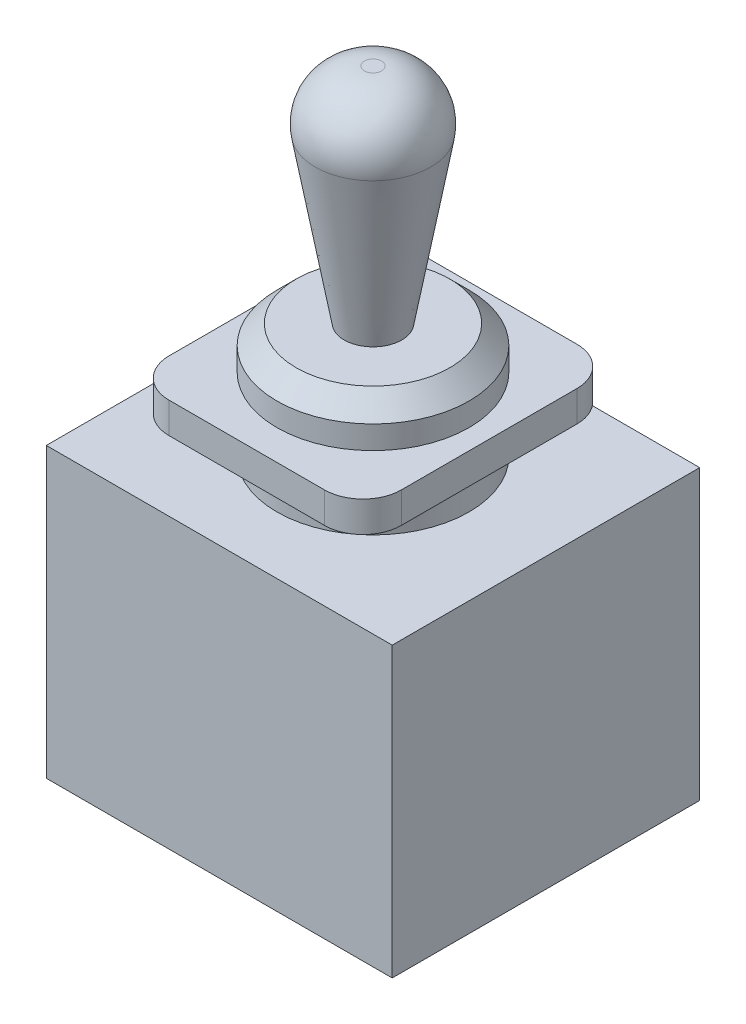
ISO-10303-21;
HEADER;
FILE_DESCRIPTION(('STEP AP214'),'2;1');
FILE_NAME('part.step','',(''),(''),'','','');
FILE_SCHEMA(('AUTOMOTIVE_DESIGN { 1 0 10303 214 1 1 1 1 }'));
ENDSEC;
DATA;
#1=APPLICATION_CONTEXT('core data for automotive mechanical design processes');
#2=APPLICATION_PROTOCOL_DEFINITION('international standard','automotive_design',2000,#1);
#3=PRODUCT_CONTEXT('',#1,'mechanical');
#4=PRODUCT('Part','Part','',(#3));
#5=PRODUCT_RELATED_PRODUCT_CATEGORY('part','',(#4));
#6=PRODUCT_DEFINITION_FORMATION('','',#4);
#7=PRODUCT_DEFINITION_CONTEXT('part definition',#1,'design');
#8=PRODUCT_DEFINITION('design','',#6,#7);
#9=PRODUCT_DEFINITION_SHAPE('','',#8);
#10=(LENGTH_UNIT() NAMED_UNIT(*) SI_UNIT(.MILLI.,.METRE.));
#11=(NAMED_UNIT(*) PLANE_ANGLE_UNIT() SI_UNIT($,.RADIAN.));
#12=(NAMED_UNIT(*) SI_UNIT($,.STERADIAN.) SOLID_ANGLE_UNIT());
#13=UNCERTAINTY_MEASURE_WITH_UNIT(LENGTH_MEASURE(1.E-05),#10,'distance_accuracy_value','');
#14=(GEOMETRIC_REPRESENTATION_CONTEXT(3) GLOBAL_UNCERTAINTY_ASSIGNED_CONTEXT((#13)) GLOBAL_UNIT_ASSIGNED_CONTEXT((#10,
#11,#12)) REPRESENTATION_CONTEXT('',''));
#15=CARTESIAN_POINT('',(0.,0.,0.));
#16=DIRECTION('',(0.,0.,1.));
#17=DIRECTION('',(1.,0.,0.));
#18=AXIS2_PLACEMENT_3D('',#15,#16,#17);
#19=CARTESIAN_POINT('',(4.5,3.75,-4.));
#20=DIRECTION('',(-1.,0.,0.));
#21=DIRECTION('',(0.,0.,1.));
#22=AXIS2_PLACEMENT_3D('',#19,#20,#21);
#23=PLANE('',#22);
#24=DIRECTION('',(0.,0.,-1.));
#25=VECTOR('',#24,1.);
#26=CARTESIAN_POINT('',(4.5,-3.75,-4.));
#27=LINE('',#26,#25);
#28=CARTESIAN_POINT('',(4.5,-3.75,4.));
#29=VERTEX_POINT('',#28);
#30=CARTESIAN_POINT('',(4.5,-3.75,-4.));
#31=VERTEX_POINT('',#30);
#32=EDGE_CURVE('E229',#29,#31,#27,.T.);
#33=ORIENTED_EDGE('',*,*,#32,.T.);
#34=DIRECTION('',(0.,-1.,0.));
#35=VECTOR('',#34,1.);
#36=CARTESIAN_POINT('',(4.5,3.75,-4.));
#37=LINE('',#36,#35);
#38=CARTESIAN_POINT('',(4.5,3.75,-4.));
#39=VERTEX_POINT('',#38);
#40=EDGE_CURVE('E221',#39,#31,#37,.T.);
#41=ORIENTED_EDGE('',*,*,#40,.F.);
#42=DIRECTION('',(0.,0.,-1.));
#43=VECTOR('',#42,1.);
#44=CARTESIAN_POINT('',(4.5,3.75,-4.));
#45=LINE('',#44,#43);
#46=CARTESIAN_POINT('',(4.5,3.75,4.));
#47=VERTEX_POINT('',#46);
#48=EDGE_CURVE('E222',#47,#39,#45,.T.);
#49=ORIENTED_EDGE('',*,*,#48,.F.);
#50=DIRECTION('',(0.,-1.,0.));
#51=VECTOR('',#50,1.);
#52=CARTESIAN_POINT('',(4.5,3.75,4.));
#53=LINE('',#52,#51);
#54=EDGE_CURVE('E228',#47,#29,#53,.T.);
#55=ORIENTED_EDGE('',*,*,#54,.T.);
#56=EDGE_LOOP('',(#33,#41,#49,#55));
#57=FACE_BOUND('',#56,.T.);
#58=ADVANCED_FACE('F39',(#57),#23,.F.);
#59=CARTESIAN_POINT('',(-4.5,3.75,-4.));
#60=DIRECTION('',(0.,0.,1.));
#61=DIRECTION('',(1.,0.,0.));
#62=AXIS2_PLACEMENT_3D('',#59,#60,#61);
#63=PLANE('',#62);
#64=DIRECTION('',(-1.,0.,0.));
#65=VECTOR('',#64,1.);
#66=CARTESIAN_POINT('',(-4.5,-3.75,-4.));
#67=LINE('',#66,#65);
#68=CARTESIAN_POINT('',(-4.5,-3.75,-4.));
#69=VERTEX_POINT('',#68);
#70=EDGE_CURVE('E232',#31,#69,#67,.T.);
#71=ORIENTED_EDGE('',*,*,#70,.T.);
#72=DIRECTION('',(0.,-1.,0.));
#73=VECTOR('',#72,1.);
#74=CARTESIAN_POINT('',(-4.5,3.75,-4.));
#75=LINE('',#74,#73);
#76=CARTESIAN_POINT('',(-4.5,3.75,-4.));
#77=VERTEX_POINT('',#76);
#78=EDGE_CURVE('E239',#77,#69,#75,.T.);
#79=ORIENTED_EDGE('',*,*,#78,.F.);
#80=DIRECTION('',(-1.,0.,0.));
#81=VECTOR('',#80,1.);
#82=CARTESIAN_POINT('',(-4.5,3.75,-4.));
#83=LINE('',#82,#81);
#84=EDGE_CURVE('E88',#39,#77,#83,.T.);
#85=ORIENTED_EDGE('',*,*,#84,.F.);
#86=ORIENTED_EDGE('',*,*,#40,.T.);
#87=EDGE_LOOP('',(#71,#79,#85,#86));
#88=FACE_BOUND('',#87,.T.);
#89=ADVANCED_FACE('F279',(#88),#63,.F.);
#90=CARTESIAN_POINT('',(-4.5,3.75,-4.));
#91=DIRECTION('',(1.,0.,0.));
#92=DIRECTION('',(0.,0.,-1.));
#93=AXIS2_PLACEMENT_3D('',#90,#91,#92);
#94=PLANE('',#93);
#95=DIRECTION('',(0.,0.,1.));
#96=VECTOR('',#95,1.);
#97=CARTESIAN_POINT('',(-4.5,-3.75,-4.));
#98=LINE('',#97,#96);
#99=CARTESIAN_POINT('',(-4.5,-3.75,4.));
#100=VERTEX_POINT('',#99);
#101=EDGE_CURVE('E74',#69,#100,#98,.T.);
#102=ORIENTED_EDGE('',*,*,#101,.T.);
#103=DIRECTION('',(0.,-1.,0.));
#104=VECTOR('',#103,1.);
#105=CARTESIAN_POINT('',(-4.5,3.75,4.));
#106=LINE('',#105,#104);
#107=CARTESIAN_POINT('',(-4.5,3.75,4.));
#108=VERTEX_POINT('',#107);
#109=EDGE_CURVE('E237',#108,#100,#106,.T.);
#110=ORIENTED_EDGE('',*,*,#109,.F.);
#111=DIRECTION('',(0.,0.,1.));
#112=VECTOR('',#111,1.);
#113=CARTESIAN_POINT('',(-4.5,3.75,-4.));
#114=LINE('',#113,#112);
#115=EDGE_CURVE('E225',#77,#108,#114,.T.);
#116=ORIENTED_EDGE('',*,*,#115,.F.);
#117=ORIENTED_EDGE('',*,*,#78,.T.);
#118=EDGE_LOOP('',(#102,#110,#116,#117));
#119=FACE_BOUND('',#118,.T.);
#120=ADVANCED_FACE('F284',(#119),#94,.F.);
#121=CARTESIAN_POINT('',(-4.5,3.75,4.));
#122=DIRECTION('',(0.,0.,-1.));
#123=DIRECTION('',(-1.,0.,0.));
#124=AXIS2_PLACEMENT_3D('',#121,#122,#123);
#125=PLANE('',#124);
#126=DIRECTION('',(1.,0.,0.));
#127=VECTOR('',#126,1.);
#128=CARTESIAN_POINT('',(-4.5,-3.75,4.));
#129=LINE('',#128,#127);
#130=EDGE_CURVE('E80',#100,#29,#129,.T.);
#131=ORIENTED_EDGE('',*,*,#130,.T.);
#132=ORIENTED_EDGE('',*,*,#54,.F.);
#133=DIRECTION('',(1.,0.,0.));
#134=VECTOR('',#133,1.);
#135=CARTESIAN_POINT('',(-4.5,3.75,4.));
#136=LINE('',#135,#134);
#137=EDGE_CURVE('E56',#108,#47,#136,.T.);
#138=ORIENTED_EDGE('',*,*,#137,.F.);
#139=ORIENTED_EDGE('',*,*,#109,.T.);
#140=EDGE_LOOP('',(#131,#132,#138,#139));
#141=FACE_BOUND('',#140,.T.);
#142=ADVANCED_FACE('F289',(#141),#125,.F.);
#143=CARTESIAN_POINT('',(0.,3.75,0.));
#144=DIRECTION('',(0.,1.,0.));
#145=DIRECTION('',(0.,0.,1.));
#146=AXIS2_PLACEMENT_3D('',#143,#144,#145);
#147=PLANE('',#146);
#148=CARTESIAN_POINT('',(0.,3.75,0.));
#149=DIRECTION('',(0.,1.,0.));
#150=DIRECTION('',(0.,0.,1.));
#151=AXIS2_PLACEMENT_3D('',#148,#149,#150);
#152=CIRCLE('',#151,2.5);
#153=CARTESIAN_POINT('',(0.,3.75,2.5));
#154=VERTEX_POINT('',#153);
#155=EDGE_CURVE('E217',#154,#154,#152,.T.);
#156=ORIENTED_EDGE('',*,*,#155,.F.);
#157=EDGE_LOOP('',(#156));
#158=FACE_BOUND('',#157,.T.);
#159=ORIENTED_EDGE('',*,*,#48,.T.);
#160=ORIENTED_EDGE('',*,*,#84,.T.);
#161=ORIENTED_EDGE('',*,*,#115,.T.);
#162=ORIENTED_EDGE('',*,*,#137,.T.);
#163=EDGE_LOOP('',(#159,#160,#161,#162));
#164=FACE_BOUND('',#163,.T.);
#165=ADVANCED_FACE('F292',(#158,#164),#147,.T.);
#166=CARTESIAN_POINT('',(0.,-3.75,0.));
#167=DIRECTION('',(0.,1.,0.));
#168=DIRECTION('',(0.,0.,1.));
#169=AXIS2_PLACEMENT_3D('',#166,#167,#168);
#170=PLANE('',#169);
#171=ORIENTED_EDGE('',*,*,#32,.F.);
#172=ORIENTED_EDGE('',*,*,#130,.F.);
#173=ORIENTED_EDGE('',*,*,#101,.F.);
#174=ORIENTED_EDGE('',*,*,#70,.F.);
#175=EDGE_LOOP('',(#171,#172,#173,#174));
#176=FACE_BOUND('',#175,.T.);
#177=ADVANCED_FACE('F293',(#176),#170,.F.);
#178=CARTESIAN_POINT('',(0.,6.75,0.));
#179=DIRECTION('',(0.,-1.,0.));
#180=DIRECTION('',(0.,0.,-1.));
#181=AXIS2_PLACEMENT_3D('',#178,#179,#180);
#182=CYLINDRICAL_SURFACE('',#181,2.5);
#183=CARTESIAN_POINT('',(0.,4.85,0.));
#184=DIRECTION('',(0.,-1.,0.));
#185=DIRECTION('',(0.,0.,-1.));
#186=AXIS2_PLACEMENT_3D('',#183,#184,#185);
#187=CIRCLE('',#186,2.5);
#188=CARTESIAN_POINT('',(0.,4.85,-2.5));
#189=VERTEX_POINT('',#188);
#190=EDGE_CURVE('E205',#189,#189,#187,.T.);
#191=ORIENTED_EDGE('',*,*,#190,.T.);
#192=EDGE_LOOP('',(#191));
#193=FACE_BOUND('',#192,.T.);
#194=ORIENTED_EDGE('',*,*,#155,.T.);
#195=EDGE_LOOP('',(#194));
#196=FACE_BOUND('',#195,.T.);
#197=ADVANCED_FACE('F275',(#193,#196),#182,.T.);
#198=CARTESIAN_POINT('',(-2.02098771719152,4.85,2.28326018123561));
#199=DIRECTION('',(0.,1.,0.));
#200=DIRECTION('',(0.,0.,1.));
#201=AXIS2_PLACEMENT_3D('',#198,#199,#200);
#202=CYLINDRICAL_SURFACE('',#201,1.);
#203=CARTESIAN_POINT('',(-2.02098771719152,5.65,2.28326018123561));
#204=DIRECTION('',(0.,1.,0.));
#205=DIRECTION('',(0.,0.,-1.));
#206=AXIS2_PLACEMENT_3D('',#203,#204,#205);
#207=CIRCLE('',#206,1.);
#208=CARTESIAN_POINT('',(-3.02098771719152,5.65,2.28326018123561));
#209=VERTEX_POINT('',#208);
#210=CARTESIAN_POINT('',(-2.02098771719152,5.65,3.28326018123561));
#211=VERTEX_POINT('',#210);
#212=EDGE_CURVE('E187',#209,#211,#207,.T.);
#213=ORIENTED_EDGE('',*,*,#212,.F.);
#214=DIRECTION('',(0.,1.,0.));
#215=VECTOR('',#214,1.);
#216=CARTESIAN_POINT('',(-3.02098771719152,4.85,2.28326018123561));
#217=LINE('',#216,#215);
#218=CARTESIAN_POINT('',(-3.02098771719152,4.85,2.28326018123561));
#219=VERTEX_POINT('',#218);
#220=EDGE_CURVE('E164',#219,#209,#217,.T.);
#221=ORIENTED_EDGE('',*,*,#220,.F.);
#222=CARTESIAN_POINT('',(-2.02098771719152,4.85,2.28326018123561));
#223=DIRECTION('',(0.,1.,0.));
#224=DIRECTION('',(0.,0.,-1.));
#225=AXIS2_PLACEMENT_3D('',#222,#223,#224);
#226=CIRCLE('',#225,1.);
#227=CARTESIAN_POINT('',(-2.02098771719152,4.85,3.28326018123561));
#228=VERTEX_POINT('',#227);
#229=EDGE_CURVE('E157',#219,#228,#226,.T.);
#230=ORIENTED_EDGE('',*,*,#229,.T.);
#231=DIRECTION('',(0.,1.,0.));
#232=VECTOR('',#231,1.);
#233=CARTESIAN_POINT('',(-2.02098771719152,4.85,3.28326018123561));
#234=LINE('',#233,#232);
#235=EDGE_CURVE('E139',#228,#211,#234,.T.);
#236=ORIENTED_EDGE('',*,*,#235,.T.);
#237=EDGE_LOOP('',(#213,#221,#230,#236));
#238=FACE_BOUND('',#237,.T.);
#239=ADVANCED_FACE('F163',(#238),#202,.T.);
#240=CARTESIAN_POINT('',(-3.02098771719152,4.85,2.28326018123561));
#241=DIRECTION('',(-1.,0.,0.));
#242=DIRECTION('',(0.,0.,1.));
#243=AXIS2_PLACEMENT_3D('',#240,#241,#242);
#244=PLANE('',#243);
#245=DIRECTION('',(0.,0.,1.));
#246=VECTOR('',#245,1.);
#247=CARTESIAN_POINT('',(-3.02098771719152,5.65,2.28326018123561));
#248=LINE('',#247,#246);
#249=CARTESIAN_POINT('',(-3.02098771719152,5.65,-2.28326018123561));
#250=VERTEX_POINT('',#249);
#251=EDGE_CURVE('E165',#250,#209,#248,.T.);
#252=ORIENTED_EDGE('',*,*,#251,.F.);
#253=DIRECTION('',(0.,1.,0.));
#254=VECTOR('',#253,1.);
#255=CARTESIAN_POINT('',(-3.02098771719152,4.85,-2.28326018123561));
#256=LINE('',#255,#254);
#257=CARTESIAN_POINT('',(-3.02098771719152,4.85,-2.28326018123561));
#258=VERTEX_POINT('',#257);
#259=EDGE_CURVE('E206',#258,#250,#256,.T.);
#260=ORIENTED_EDGE('',*,*,#259,.F.);
#261=DIRECTION('',(0.,0.,1.));
#262=VECTOR('',#261,1.);
#263=CARTESIAN_POINT('',(-3.02098771719152,4.85,2.28326018123561));
#264=LINE('',#263,#262);
#265=EDGE_CURVE('E150',#258,#219,#264,.T.);
#266=ORIENTED_EDGE('',*,*,#265,.T.);
#267=ORIENTED_EDGE('',*,*,#220,.T.);
#268=EDGE_LOOP('',(#252,#260,#266,#267));
#269=FACE_BOUND('',#268,.T.);
#270=ADVANCED_FACE('F304',(#269),#244,.T.);
#271=CARTESIAN_POINT('',(-2.02098771719152,4.85,-2.28326018123561));
#272=DIRECTION('',(0.,1.,0.));
#273=DIRECTION('',(0.,0.,1.));
#274=AXIS2_PLACEMENT_3D('',#271,#272,#273);
#275=CYLINDRICAL_SURFACE('',#274,1.);
#276=CARTESIAN_POINT('',(-2.02098771719152,5.65,-2.28326018123561));
#277=DIRECTION('',(0.,1.,0.));
#278=DIRECTION('',(0.,0.,-1.));
#279=AXIS2_PLACEMENT_3D('',#276,#277,#278);
#280=CIRCLE('',#279,1.);
#281=CARTESIAN_POINT('',(-2.02098771719152,5.65,-3.28326018123561));
#282=VERTEX_POINT('',#281);
#283=EDGE_CURVE('E168',#282,#250,#280,.T.);
#284=ORIENTED_EDGE('',*,*,#283,.F.);
#285=DIRECTION('',(0.,1.,0.));
#286=VECTOR('',#285,1.);
#287=CARTESIAN_POINT('',(-2.02098771719152,4.85,-3.28326018123561));
#288=LINE('',#287,#286);
#289=CARTESIAN_POINT('',(-2.02098771719152,4.85,-3.28326018123561));
#290=VERTEX_POINT('',#289);
#291=EDGE_CURVE('E208',#290,#282,#288,.T.);
#292=ORIENTED_EDGE('',*,*,#291,.F.);
#293=CARTESIAN_POINT('',(-2.02098771719152,4.85,-2.28326018123561));
#294=DIRECTION('',(0.,1.,0.));
#295=DIRECTION('',(0.,0.,-1.));
#296=AXIS2_PLACEMENT_3D('',#293,#294,#295);
#297=CIRCLE('',#296,1.);
#298=EDGE_CURVE('E183',#290,#258,#297,.T.);
#299=ORIENTED_EDGE('',*,*,#298,.T.);
#300=ORIENTED_EDGE('',*,*,#259,.T.);
#301=EDGE_LOOP('',(#284,#292,#299,#300));
#302=FACE_BOUND('',#301,.T.);
#303=ADVANCED_FACE('F322',(#302),#275,.T.);
#304=CARTESIAN_POINT('',(-2.02098771719152,4.85,-3.28326018123561));
#305=DIRECTION('',(0.,0.,-1.));
#306=DIRECTION('',(-1.,0.,0.));
#307=AXIS2_PLACEMENT_3D('',#304,#305,#306);
#308=PLANE('',#307);
#309=DIRECTION('',(-1.,0.,0.));
#310=VECTOR('',#309,1.);
#311=CARTESIAN_POINT('',(-2.02098771719152,5.65,-3.28326018123561));
#312=LINE('',#311,#310);
#313=CARTESIAN_POINT('',(2.02098771719152,5.65,-3.28326018123561));
#314=VERTEX_POINT('',#313);
#315=EDGE_CURVE('E199',#314,#282,#312,.T.);
#316=ORIENTED_EDGE('',*,*,#315,.F.);
#317=DIRECTION('',(0.,1.,0.));
#318=VECTOR('',#317,1.);
#319=CARTESIAN_POINT('',(2.02098771719152,4.85,-3.28326018123561));
#320=LINE('',#319,#318);
#321=CARTESIAN_POINT('',(2.02098771719152,4.85,-3.28326018123561));
#322=VERTEX_POINT('',#321);
#323=EDGE_CURVE('E210',#322,#314,#320,.T.);
#324=ORIENTED_EDGE('',*,*,#323,.F.);
#325=DIRECTION('',(-1.,0.,0.));
#326=VECTOR('',#325,1.);
#327=CARTESIAN_POINT('',(-2.02098771719152,4.85,-3.28326018123561));
#328=LINE('',#327,#326);
#329=EDGE_CURVE('E180',#322,#290,#328,.T.);
#330=ORIENTED_EDGE('',*,*,#329,.T.);
#331=ORIENTED_EDGE('',*,*,#291,.T.);
#332=EDGE_LOOP('',(#316,#324,#330,#331));
#333=FACE_BOUND('',#332,.T.);
#334=ADVANCED_FACE('F318',(#333),#308,.T.);
#335=CARTESIAN_POINT('',(2.02098771719152,4.85,-2.28326018123561));
#336=DIRECTION('',(0.,1.,0.));
#337=DIRECTION('',(0.,0.,1.));
#338=AXIS2_PLACEMENT_3D('',#335,#336,#337);
#339=CYLINDRICAL_SURFACE('',#338,1.);
#340=CARTESIAN_POINT('',(2.02098771719152,5.65,-2.28326018123561));
#341=DIRECTION('',(0.,1.,0.));
#342=DIRECTION('',(0.,0.,1.));
#343=AXIS2_PLACEMENT_3D('',#340,#341,#342);
#344=CIRCLE('',#343,1.);
#345=CARTESIAN_POINT('',(3.02098771719152,5.65,-2.28326018123561));
#346=VERTEX_POINT('',#345);
#347=EDGE_CURVE('E196',#346,#314,#344,.T.);
#348=ORIENTED_EDGE('',*,*,#347,.F.);
#349=DIRECTION('',(0.,1.,0.));
#350=VECTOR('',#349,1.);
#351=CARTESIAN_POINT('',(3.02098771719152,4.85,-2.28326018123561));
#352=LINE('',#351,#350);
#353=CARTESIAN_POINT('',(3.02098771719152,4.85,-2.28326018123561));
#354=VERTEX_POINT('',#353);
#355=EDGE_CURVE('E212',#354,#346,#352,.T.);
#356=ORIENTED_EDGE('',*,*,#355,.F.);
#357=CARTESIAN_POINT('',(2.02098771719152,4.85,-2.28326018123561));
#358=DIRECTION('',(0.,1.,0.));
#359=DIRECTION('',(0.,0.,1.));
#360=AXIS2_PLACEMENT_3D('',#357,#358,#359);
#361=CIRCLE('',#360,1.);
#362=EDGE_CURVE('E177',#354,#322,#361,.T.);
#363=ORIENTED_EDGE('',*,*,#362,.T.);
#364=ORIENTED_EDGE('',*,*,#323,.T.);
#365=EDGE_LOOP('',(#348,#356,#363,#364));
#366=FACE_BOUND('',#365,.T.);
#367=ADVANCED_FACE('F314',(#366),#339,.T.);
#368=CARTESIAN_POINT('',(3.02098771719152,4.85,2.28326018123561));
#369=DIRECTION('',(1.,0.,0.));
#370=DIRECTION('',(0.,0.,-1.));
#371=AXIS2_PLACEMENT_3D('',#368,#369,#370);
#372=PLANE('',#371);
#373=DIRECTION('',(0.,0.,-1.));
#374=VECTOR('',#373,1.);
#375=CARTESIAN_POINT('',(3.02098771719152,5.65,2.28326018123561));
#376=LINE('',#375,#374);
#377=CARTESIAN_POINT('',(3.02098771719152,5.65,2.28326018123561));
#378=VERTEX_POINT('',#377);
#379=EDGE_CURVE('E193',#378,#346,#376,.T.);
#380=ORIENTED_EDGE('',*,*,#379,.F.);
#381=DIRECTION('',(0.,1.,0.));
#382=VECTOR('',#381,1.);
#383=CARTESIAN_POINT('',(3.02098771719152,4.85,2.28326018123561));
#384=LINE('',#383,#382);
#385=CARTESIAN_POINT('',(3.02098771719152,4.85,2.28326018123561));
#386=VERTEX_POINT('',#385);
#387=EDGE_CURVE('E214',#386,#378,#384,.T.);
#388=ORIENTED_EDGE('',*,*,#387,.F.);
#389=DIRECTION('',(0.,0.,-1.));
#390=VECTOR('',#389,1.);
#391=CARTESIAN_POINT('',(3.02098771719152,4.85,2.28326018123561));
#392=LINE('',#391,#390);
#393=EDGE_CURVE('E174',#386,#354,#392,.T.);
#394=ORIENTED_EDGE('',*,*,#393,.T.);
#395=ORIENTED_EDGE('',*,*,#355,.T.);
#396=EDGE_LOOP('',(#380,#388,#394,#395));
#397=FACE_BOUND('',#396,.T.);
#398=ADVANCED_FACE('F310',(#397),#372,.T.);
#399=CARTESIAN_POINT('',(2.02098771719152,4.85,2.28326018123561));
#400=DIRECTION('',(0.,1.,0.));
#401=DIRECTION('',(0.,0.,1.));
#402=AXIS2_PLACEMENT_3D('',#399,#400,#401);
#403=CYLINDRICAL_SURFACE('',#402,1.);
#404=CARTESIAN_POINT('',(2.02098771719152,5.65,2.28326018123561));
#405=DIRECTION('',(0.,1.,0.));
#406=DIRECTION('',(0.,0.,-1.));
#407=AXIS2_PLACEMENT_3D('',#404,#405,#406);
#408=CIRCLE('',#407,1.);
#409=CARTESIAN_POINT('',(2.02098771719152,5.65,3.28326018123561));
#410=VERTEX_POINT('',#409);
#411=EDGE_CURVE('E190',#410,#378,#408,.T.);
#412=ORIENTED_EDGE('',*,*,#411,.F.);
#413=DIRECTION('',(0.,1.,0.));
#414=VECTOR('',#413,1.);
#415=CARTESIAN_POINT('',(2.02098771719152,4.85,3.28326018123561));
#416=LINE('',#415,#414);
#417=CARTESIAN_POINT('',(2.02098771719152,4.85,3.28326018123561));
#418=VERTEX_POINT('',#417);
#419=EDGE_CURVE('E149',#418,#410,#416,.T.);
#420=ORIENTED_EDGE('',*,*,#419,.F.);
#421=CARTESIAN_POINT('',(2.02098771719152,4.85,2.28326018123561));
#422=DIRECTION('',(0.,1.,0.));
#423=DIRECTION('',(0.,0.,-1.));
#424=AXIS2_PLACEMENT_3D('',#421,#422,#423);
#425=CIRCLE('',#424,1.);
#426=EDGE_CURVE('E161',#418,#386,#425,.T.);
#427=ORIENTED_EDGE('',*,*,#426,.T.);
#428=ORIENTED_EDGE('',*,*,#387,.T.);
#429=EDGE_LOOP('',(#412,#420,#427,#428));
#430=FACE_BOUND('',#429,.T.);
#431=ADVANCED_FACE('F307',(#430),#403,.T.);
#432=CARTESIAN_POINT('',(-2.02098771719152,4.85,3.28326018123561));
#433=DIRECTION('',(0.,0.,1.));
#434=DIRECTION('',(1.,0.,0.));
#435=AXIS2_PLACEMENT_3D('',#432,#433,#434);
#436=PLANE('',#435);
#437=DIRECTION('',(1.,0.,0.));
#438=VECTOR('',#437,1.);
#439=CARTESIAN_POINT('',(-2.02098771719152,5.65,3.28326018123561));
#440=LINE('',#439,#438);
#441=EDGE_CURVE('E144',#211,#410,#440,.T.);
#442=ORIENTED_EDGE('',*,*,#441,.F.);
#443=ORIENTED_EDGE('',*,*,#235,.F.);
#444=DIRECTION('',(1.,0.,0.));
#445=VECTOR('',#444,1.);
#446=CARTESIAN_POINT('',(-2.02098771719152,4.85,3.28326018123561));
#447=LINE('',#446,#445);
#448=EDGE_CURVE('E142',#228,#418,#447,.T.);
#449=ORIENTED_EDGE('',*,*,#448,.T.);
#450=ORIENTED_EDGE('',*,*,#419,.T.);
#451=EDGE_LOOP('',(#442,#443,#449,#450));
#452=FACE_BOUND('',#451,.T.);
#453=ADVANCED_FACE('F141',(#452),#436,.T.);
#454=CARTESIAN_POINT('',(-2.02098771719152,4.85,2.28326018123561));
#455=DIRECTION('',(0.,-1.,0.));
#456=DIRECTION('',(0.,0.,-1.));
#457=AXIS2_PLACEMENT_3D('',#454,#455,#456);
#458=PLANE('',#457);
#459=ORIENTED_EDGE('',*,*,#190,.F.);
#460=EDGE_LOOP('',(#459));
#461=FACE_BOUND('',#460,.T.);
#462=ORIENTED_EDGE('',*,*,#229,.F.);
#463=ORIENTED_EDGE('',*,*,#265,.F.);
#464=ORIENTED_EDGE('',*,*,#298,.F.);
#465=ORIENTED_EDGE('',*,*,#329,.F.);
#466=ORIENTED_EDGE('',*,*,#362,.F.);
#467=ORIENTED_EDGE('',*,*,#393,.F.);
#468=ORIENTED_EDGE('',*,*,#426,.F.);
#469=ORIENTED_EDGE('',*,*,#448,.F.);
#470=EDGE_LOOP('',(#462,#463,#464,#465,#466,#467,#468,#469));
#471=FACE_BOUND('',#470,.T.);
#472=ADVANCED_FACE('F155',(#461,#471),#458,.T.);
#473=CARTESIAN_POINT('',(-2.02098771719152,5.65,2.28326018123561));
#474=DIRECTION('',(0.,-1.,0.));
#475=DIRECTION('',(0.,0.,-1.));
#476=AXIS2_PLACEMENT_3D('',#473,#474,#475);
#477=PLANE('',#476);
#478=CARTESIAN_POINT('',(0.,5.65,0.));
#479=DIRECTION('',(0.,-1.,0.));
#480=DIRECTION('',(0.,0.,-1.));
#481=AXIS2_PLACEMENT_3D('',#478,#479,#480);
#482=CIRCLE('',#481,2.5);
#483=CARTESIAN_POINT('',(0.,5.65,-2.5));
#484=VERTEX_POINT('',#483);
#485=EDGE_CURVE('E247',#484,#484,#482,.T.);
#486=ORIENTED_EDGE('',*,*,#485,.T.);
#487=EDGE_LOOP('',(#486));
#488=FACE_BOUND('',#487,.T.);
#489=ORIENTED_EDGE('',*,*,#212,.T.);
#490=ORIENTED_EDGE('',*,*,#441,.T.);
#491=ORIENTED_EDGE('',*,*,#411,.T.);
#492=ORIENTED_EDGE('',*,*,#379,.T.);
#493=ORIENTED_EDGE('',*,*,#347,.T.);
#494=ORIENTED_EDGE('',*,*,#315,.T.);
#495=ORIENTED_EDGE('',*,*,#283,.T.);
#496=ORIENTED_EDGE('',*,*,#251,.T.);
#497=EDGE_LOOP('',(#489,#490,#491,#492,#493,#494,#495,#496));
#498=FACE_BOUND('',#497,.T.);
#499=ADVANCED_FACE('F263',(#488,#498),#477,.F.);
#500=CARTESIAN_POINT('',(0.,6.75,0.));
#501=DIRECTION('',(0.,1.,0.));
#502=DIRECTION('',(0.,0.,1.));
#503=AXIS2_PLACEMENT_3D('',#500,#501,#502);
#504=PLANE('',#503);
#505=CARTESIAN_POINT('',(0.,6.75,0.));
#506=DIRECTION('',(0.,1.,0.));
#507=DIRECTION('',(0.,0.,1.));
#508=AXIS2_PLACEMENT_3D('',#505,#506,#507);
#509=CIRCLE('',#508,0.75);
#510=CARTESIAN_POINT('',(0.,6.75,0.75));
#511=VERTEX_POINT('',#510);
#512=EDGE_CURVE('E171',#511,#511,#509,.T.);
#513=ORIENTED_EDGE('',*,*,#512,.F.);
#514=EDGE_LOOP('',(#513));
#515=FACE_BOUND('',#514,.T.);
#516=CARTESIAN_POINT('',(0.,6.75,0.));
#517=DIRECTION('',(0.,1.,0.));
#518=DIRECTION('',(0.,0.,1.));
#519=AXIS2_PLACEMENT_3D('',#516,#517,#518);
#520=CIRCLE('',#519,2.);
#521=CARTESIAN_POINT('',(0.,6.75,2.));
#522=VERTEX_POINT('',#521);
#523=EDGE_CURVE('E220',#522,#522,#520,.T.);
#524=ORIENTED_EDGE('',*,*,#523,.T.);
#525=EDGE_LOOP('',(#524));
#526=FACE_BOUND('',#525,.T.);
#527=ADVANCED_FACE('F259',(#515,#526),#504,.T.);
#528=CARTESIAN_POINT('',(0.,6.75,0.));
#529=DIRECTION('',(0.,-1.,0.));
#530=DIRECTION('',(0.,0.,-1.));
#531=AXIS2_PLACEMENT_3D('',#528,#529,#530);
#532=CONICAL_SURFACE('',#531,2.,0.785398163397446);
#533=CARTESIAN_POINT('',(0.,6.25,0.));
#534=DIRECTION('',(0.,1.,0.));
#535=DIRECTION('',(0.,0.,1.));
#536=AXIS2_PLACEMENT_3D('',#533,#534,#535);
#537=CIRCLE('',#536,2.5);
#538=CARTESIAN_POINT('',(0.,6.25,2.5));
#539=VERTEX_POINT('',#538);
#540=EDGE_CURVE('E244',#539,#539,#537,.F.);
#541=ORIENTED_EDGE('',*,*,#540,.F.);
#542=EDGE_LOOP('',(#541));
#543=FACE_BOUND('',#542,.T.);
#544=ORIENTED_EDGE('',*,*,#523,.F.);
#545=EDGE_LOOP('',(#544));
#546=FACE_BOUND('',#545,.T.);
#547=ADVANCED_FACE('F262',(#543,#546),#532,.T.);
#548=ORIENTED_EDGE('',*,*,#540,.T.);
#549=EDGE_LOOP('',(#548));
#550=FACE_BOUND('',#549,.T.);
#551=ORIENTED_EDGE('',*,*,#485,.F.);
#552=EDGE_LOOP('',(#551));
#553=FACE_BOUND('',#552,.T.);
#554=ADVANCED_FACE('F268',(#550,#553),#182,.T.);
#555=CARTESIAN_POINT('',(0.,6.75,0.));
#556=DIRECTION('',(0.,1.,0.));
#557=DIRECTION('',(0.,0.,1.));
#558=AXIS2_PLACEMENT_3D('',#555,#556,#557);
#559=CONICAL_SURFACE('',#558,0.75,0.174532925199433);
#560=CARTESIAN_POINT('',(0.,11.024257369033,0.));
#561=DIRECTION('',(0.,1.,0.));
#562=DIRECTION('',(0.,0.,1.));
#563=AXIS2_PLACEMENT_3D('',#560,#561,#562);
#564=CIRCLE('',#563,1.5036668966525);
#565=CARTESIAN_POINT('',(0.,11.024257369033,1.5036668966525));
#566=VERTEX_POINT('',#565);
#567=EDGE_CURVE('E11',#566,#566,#564,.F.);
#568=ORIENTED_EDGE('',*,*,#567,.T.);
#569=EDGE_LOOP('',(#568));
#570=FACE_BOUND('',#569,.T.);
#571=ORIENTED_EDGE('',*,*,#512,.T.);
#572=EDGE_LOOP('',(#571));
#573=FACE_BOUND('',#572,.T.);
#574=ADVANCED_FACE('F257',(#570,#573),#559,.T.);
#575=CARTESIAN_POINT('',(0.,12.55,0.));
#576=DIRECTION('',(0.,1.,0.));
#577=DIRECTION('',(0.,0.,1.));
#578=AXIS2_PLACEMENT_3D('',#575,#576,#577);
#579=PLANE('',#578);
#580=CARTESIAN_POINT('',(0.,12.55,0.));
#581=DIRECTION('',(0.,1.,0.));
#582=DIRECTION('',(0.,0.,1.));
#583=AXIS2_PLACEMENT_3D('',#580,#581,#582);
#584=CIRCLE('',#583,0.223416817736626);
#585=CARTESIAN_POINT('',(0.,12.55,0.223416817736626));
#586=VERTEX_POINT('',#585);
#587=EDGE_CURVE('E48',#586,#586,#584,.T.);
#588=ORIENTED_EDGE('',*,*,#587,.T.);
#589=EDGE_LOOP('',(#588));
#590=FACE_BOUND('',#589,.T.);
#591=ADVANCED_FACE('F338',(#590),#579,.T.);
#592=CARTESIAN_POINT('',(0.,11.25,0.));
#593=DIRECTION('',(0.,1.,0.));
#594=DIRECTION('',(0.,0.,1.));
#595=AXIS2_PLACEMENT_3D('',#592,#593,#594);
#596=DEGENERATE_TOROIDAL_SURFACE('',#595,0.223416817736626,1.3,.T.);
#597=ORIENTED_EDGE('',*,*,#567,.F.);
#598=EDGE_LOOP('',(#597));
#599=FACE_BOUND('',#598,.T.);
#600=ORIENTED_EDGE('',*,*,#587,.F.);
#601=EDGE_LOOP('',(#600));
#602=FACE_BOUND('',#601,.T.);
#603=ADVANCED_FACE('F41',(#599,#602),#596,.T.);
#604=CLOSED_SHELL('',(#58,#89,#120,#142,#165,#177,#197,#239,#270,#303,#334,#367,#398,#431,#453,
#472,#499,#527,#547,#554,#574,#591,#603));
#605=MANIFOLD_SOLID_BREP('B2',#604);
#606=ADVANCED_BREP_SHAPE_REPRESENTATION('',(#18,#605),#14);
#607=SHAPE_DEFINITION_REPRESENTATION(#9,#606);
ENDSEC;
END-ISO-10303-21;
